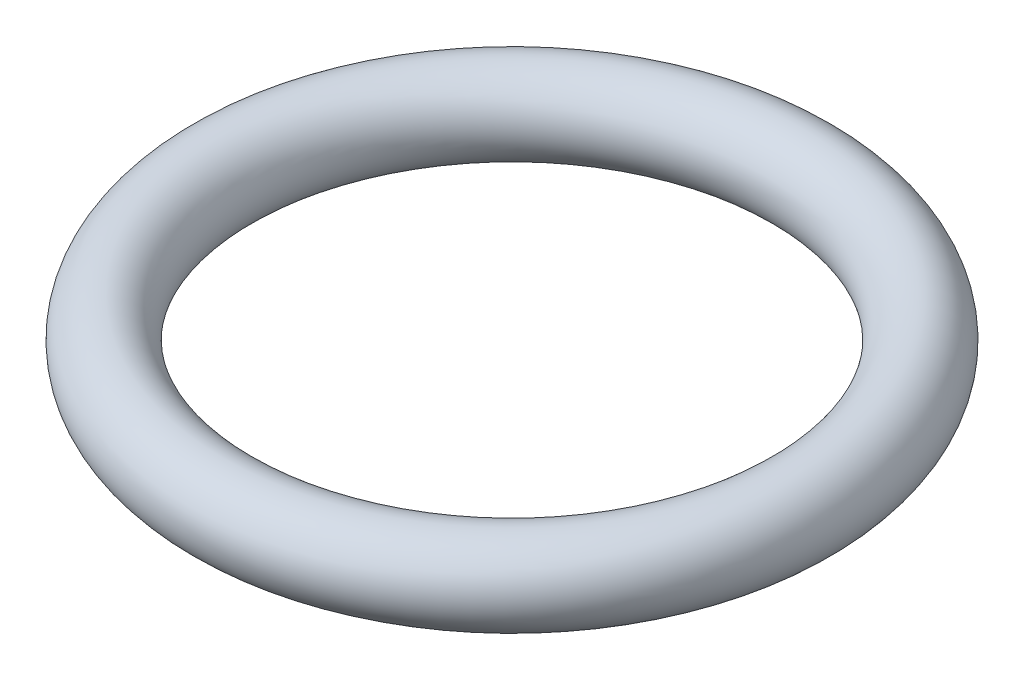
ISO-10303-21;
HEADER;
FILE_DESCRIPTION(('STEP AP214'),'2;1');
FILE_NAME('part.step','',(''),(''),'','','');
FILE_SCHEMA(('AUTOMOTIVE_DESIGN { 1 0 10303 214 1 1 1 1 }'));
ENDSEC;
DATA;
#1=APPLICATION_CONTEXT('core data for automotive mechanical design processes');
#2=APPLICATION_PROTOCOL_DEFINITION('international standard','automotive_design',2000,#1);
#3=PRODUCT_CONTEXT('',#1,'mechanical');
#4=PRODUCT('Part','Part','',(#3));
#5=PRODUCT_RELATED_PRODUCT_CATEGORY('part','',(#4));
#6=PRODUCT_DEFINITION_FORMATION('','',#4);
#7=PRODUCT_DEFINITION_CONTEXT('part definition',#1,'design');
#8=PRODUCT_DEFINITION('design','',#6,#7);
#9=PRODUCT_DEFINITION_SHAPE('','',#8);
#10=(LENGTH_UNIT() NAMED_UNIT(*) SI_UNIT(.MILLI.,.METRE.));
#11=(NAMED_UNIT(*) PLANE_ANGLE_UNIT() SI_UNIT($,.RADIAN.));
#12=(NAMED_UNIT(*) SI_UNIT($,.STERADIAN.) SOLID_ANGLE_UNIT());
#13=UNCERTAINTY_MEASURE_WITH_UNIT(LENGTH_MEASURE(1.E-05),#10,'distance_accuracy_value','');
#14=(GEOMETRIC_REPRESENTATION_CONTEXT(3) GLOBAL_UNCERTAINTY_ASSIGNED_CONTEXT((#13)) GLOBAL_UNIT_ASSIGNED_CONTEXT((#10,
#11,#12)) REPRESENTATION_CONTEXT('',''));
#15=CARTESIAN_POINT('',(0.,0.,0.));
#16=DIRECTION('',(0.,0.,1.));
#17=DIRECTION('',(1.,0.,0.));
#18=AXIS2_PLACEMENT_3D('',#15,#16,#17);
#19=CARTESIAN_POINT('',(0.,20.361,0.));
#20=DIRECTION('',(0.,-1.,0.));
#21=DIRECTION('',(0.,0.,-1.));
#22=AXIS2_PLACEMENT_3D('',#19,#20,#21);
#23=TOROIDAL_SURFACE('',#22,6.2992,0.888999999999997);
#24=CARTESIAN_POINT('',(0.,20.361,-7.1882));
#25=VERTEX_POINT('',#24);
#26=VERTEX_LOOP('',#25);
#27=FACE_BOUND('',#26,.T.);
#28=ADVANCED_FACE('F33',(#27),#23,.T.);
#29=CLOSED_SHELL('',(#28));
#30=MANIFOLD_SOLID_BREP('B2',#29);
#31=ADVANCED_BREP_SHAPE_REPRESENTATION('',(#18,#30),#14);
#32=SHAPE_DEFINITION_REPRESENTATION(#9,#31);
ENDSEC;
END-ISO-10303-21;
